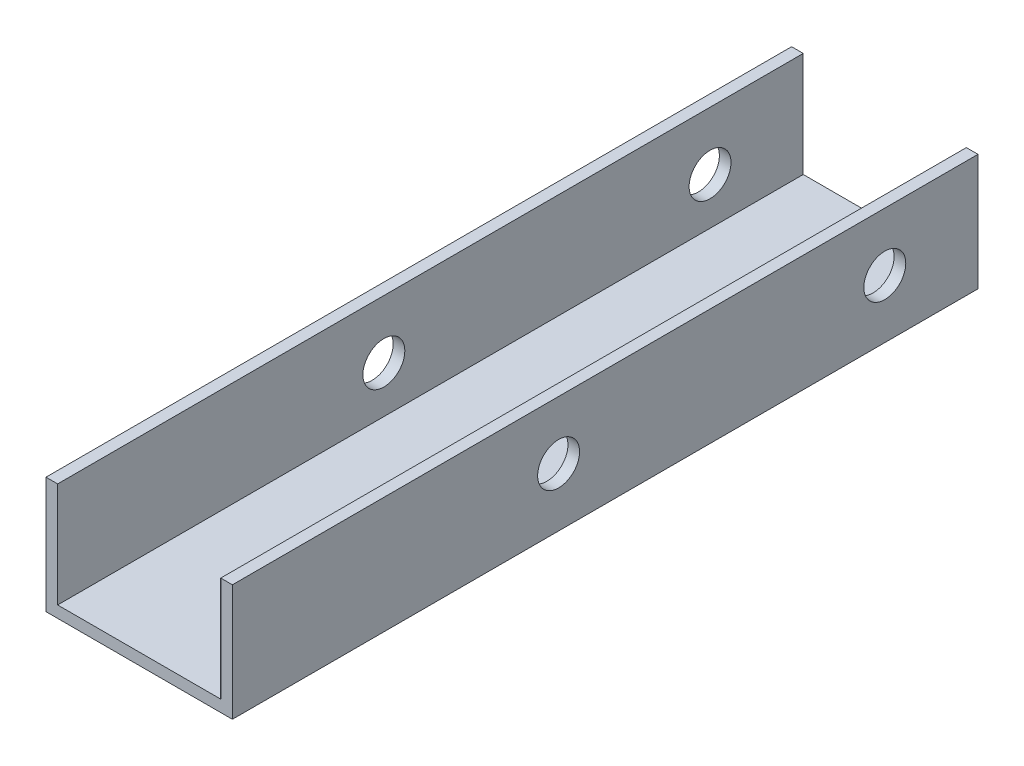
ISO-10303-21;
HEADER;
FILE_DESCRIPTION(('STEP AP214'),'2;1');
FILE_NAME('part.step','',(''),(''),'','','');
FILE_SCHEMA(('AUTOMOTIVE_DESIGN { 1 0 10303 214 1 1 1 1 }'));
ENDSEC;
DATA;
#1=APPLICATION_CONTEXT('core data for automotive mechanical design processes');
#2=APPLICATION_PROTOCOL_DEFINITION('international standard','automotive_design',2000,#1);
#3=PRODUCT_CONTEXT('',#1,'mechanical');
#4=PRODUCT('Part','Part','',(#3));
#5=PRODUCT_RELATED_PRODUCT_CATEGORY('part','',(#4));
#6=PRODUCT_DEFINITION_FORMATION('','',#4);
#7=PRODUCT_DEFINITION_CONTEXT('part definition',#1,'design');
#8=PRODUCT_DEFINITION('design','',#6,#7);
#9=PRODUCT_DEFINITION_SHAPE('','',#8);
#10=(LENGTH_UNIT() NAMED_UNIT(*) SI_UNIT(.MILLI.,.METRE.));
#11=(NAMED_UNIT(*) PLANE_ANGLE_UNIT() SI_UNIT($,.RADIAN.));
#12=(NAMED_UNIT(*) SI_UNIT($,.STERADIAN.) SOLID_ANGLE_UNIT());
#13=UNCERTAINTY_MEASURE_WITH_UNIT(LENGTH_MEASURE(1.E-05),#10,'distance_accuracy_value','');
#14=(GEOMETRIC_REPRESENTATION_CONTEXT(3) GLOBAL_UNCERTAINTY_ASSIGNED_CONTEXT((#13)) GLOBAL_UNIT_ASSIGNED_CONTEXT((#10,
#11,#12)) REPRESENTATION_CONTEXT('',''));
#15=CARTESIAN_POINT('',(0.,0.,0.));
#16=DIRECTION('',(0.,0.,1.));
#17=DIRECTION('',(1.,0.,0.));
#18=AXIS2_PLACEMENT_3D('',#15,#16,#17);
#19=CARTESIAN_POINT('',(0.,0.,500.));
#20=DIRECTION('',(1.,0.,0.));
#21=DIRECTION('',(0.,0.,-1.));
#22=AXIS2_PLACEMENT_3D('',#19,#20,#21);
#23=PLANE('',#22);
#24=CARTESIAN_POINT('',(0.,25.,330.));
#25=DIRECTION('',(1.,0.,0.));
#26=DIRECTION('',(0.,0.,-1.));
#27=AXIS2_PLACEMENT_3D('',#24,#25,#26);
#28=CIRCLE('',#27,8.99999999999998);
#29=CARTESIAN_POINT('',(0.,25.,321.));
#30=VERTEX_POINT('',#29);
#31=EDGE_CURVE('E114',#30,#30,#28,.T.);
#32=ORIENTED_EDGE('',*,*,#31,.T.);
#33=EDGE_LOOP('',(#32));
#34=FACE_BOUND('',#33,.T.);
#35=CARTESIAN_POINT('',(0.,25.,190.));
#36=DIRECTION('',(1.,0.,0.));
#37=DIRECTION('',(0.,0.,-1.));
#38=AXIS2_PLACEMENT_3D('',#35,#36,#37);
#39=CIRCLE('',#38,8.99999999999998);
#40=CARTESIAN_POINT('',(0.,25.,181.));
#41=VERTEX_POINT('',#40);
#42=EDGE_CURVE('E137',#41,#41,#39,.T.);
#43=ORIENTED_EDGE('',*,*,#42,.T.);
#44=EDGE_LOOP('',(#43));
#45=FACE_BOUND('',#44,.T.);
#46=DIRECTION('',(0.,-1.,0.));
#47=VECTOR('',#46,1.);
#48=CARTESIAN_POINT('',(0.,50.,470.));
#49=LINE('',#48,#47);
#50=CARTESIAN_POINT('',(0.,50.,470.));
#51=VERTEX_POINT('',#50);
#52=CARTESIAN_POINT('',(0.,0.,470.));
#53=VERTEX_POINT('',#52);
#54=EDGE_CURVE('E101',#51,#53,#49,.T.);
#55=ORIENTED_EDGE('',*,*,#54,.F.);
#56=DIRECTION('',(0.,0.,-1.));
#57=VECTOR('',#56,1.);
#58=CARTESIAN_POINT('',(0.,50.,500.));
#59=LINE('',#58,#57);
#60=CARTESIAN_POINT('',(0.,50.,150.));
#61=VERTEX_POINT('',#60);
#62=EDGE_CURVE('E59',#51,#61,#59,.T.);
#63=ORIENTED_EDGE('',*,*,#62,.T.);
#64=DIRECTION('',(0.,1.,0.));
#65=VECTOR('',#64,1.);
#66=CARTESIAN_POINT('',(0.,0.,150.));
#67=LINE('',#66,#65);
#68=CARTESIAN_POINT('',(0.,0.,150.));
#69=VERTEX_POINT('',#68);
#70=EDGE_CURVE('E225',#69,#61,#67,.T.);
#71=ORIENTED_EDGE('',*,*,#70,.F.);
#72=DIRECTION('',(0.,0.,-1.));
#73=VECTOR('',#72,1.);
#74=CARTESIAN_POINT('',(0.,0.,500.));
#75=LINE('',#74,#73);
#76=EDGE_CURVE('E11',#53,#69,#75,.T.);
#77=ORIENTED_EDGE('',*,*,#76,.F.);
#78=EDGE_LOOP('',(#55,#63,#71,#77));
#79=FACE_BOUND('',#78,.T.);
#80=ADVANCED_FACE('F35',(#34,#45,#79),#23,.F.);
#81=CARTESIAN_POINT('',(0.,0.,500.));
#82=DIRECTION('',(0.,1.,0.));
#83=DIRECTION('',(0.,0.,1.));
#84=AXIS2_PLACEMENT_3D('',#81,#82,#83);
#85=PLANE('',#84);
#86=DIRECTION('',(1.,0.,0.));
#87=VECTOR('',#86,1.);
#88=CARTESIAN_POINT('',(0.,0.,470.));
#89=LINE('',#88,#87);
#90=CARTESIAN_POINT('',(80.,0.,470.));
#91=VERTEX_POINT('',#90);
#92=EDGE_CURVE('E107',#53,#91,#89,.T.);
#93=ORIENTED_EDGE('',*,*,#92,.F.);
#94=ORIENTED_EDGE('',*,*,#76,.T.);
#95=DIRECTION('',(-1.,0.,0.));
#96=VECTOR('',#95,1.);
#97=CARTESIAN_POINT('',(80.,0.,150.));
#98=LINE('',#97,#96);
#99=CARTESIAN_POINT('',(80.,0.,150.));
#100=VERTEX_POINT('',#99);
#101=EDGE_CURVE('E227',#100,#69,#98,.T.);
#102=ORIENTED_EDGE('',*,*,#101,.F.);
#103=DIRECTION('',(0.,0.,-1.));
#104=VECTOR('',#103,1.);
#105=CARTESIAN_POINT('',(80.,0.,500.));
#106=LINE('',#105,#104);
#107=EDGE_CURVE('E43',#91,#100,#106,.T.);
#108=ORIENTED_EDGE('',*,*,#107,.F.);
#109=EDGE_LOOP('',(#93,#94,#102,#108));
#110=FACE_BOUND('',#109,.T.);
#111=ADVANCED_FACE('F170',(#110),#85,.F.);
#112=CARTESIAN_POINT('',(80.,0.,500.));
#113=DIRECTION('',(-1.,0.,0.));
#114=DIRECTION('',(0.,0.,1.));
#115=AXIS2_PLACEMENT_3D('',#112,#113,#114);
#116=PLANE('',#115);
#117=CARTESIAN_POINT('',(80.,25.,330.));
#118=DIRECTION('',(1.,0.,0.));
#119=DIRECTION('',(0.,0.,-1.));
#120=AXIS2_PLACEMENT_3D('',#117,#118,#119);
#121=CIRCLE('',#120,8.99999999999998);
#122=CARTESIAN_POINT('',(80.,25.,321.));
#123=VERTEX_POINT('',#122);
#124=EDGE_CURVE('E133',#123,#123,#121,.T.);
#125=ORIENTED_EDGE('',*,*,#124,.F.);
#126=EDGE_LOOP('',(#125));
#127=FACE_BOUND('',#126,.T.);
#128=CARTESIAN_POINT('',(80.,25.,190.));
#129=DIRECTION('',(1.,0.,0.));
#130=DIRECTION('',(0.,0.,-1.));
#131=AXIS2_PLACEMENT_3D('',#128,#129,#130);
#132=CIRCLE('',#131,8.99999999999998);
#133=CARTESIAN_POINT('',(80.,25.,181.));
#134=VERTEX_POINT('',#133);
#135=EDGE_CURVE('E140',#134,#134,#132,.T.);
#136=ORIENTED_EDGE('',*,*,#135,.F.);
#137=EDGE_LOOP('',(#136));
#138=FACE_BOUND('',#137,.T.);
#139=DIRECTION('',(0.,1.,0.));
#140=VECTOR('',#139,1.);
#141=CARTESIAN_POINT('',(80.,0.,470.));
#142=LINE('',#141,#140);
#143=CARTESIAN_POINT('',(80.,50.,470.));
#144=VERTEX_POINT('',#143);
#145=EDGE_CURVE('E233',#91,#144,#142,.T.);
#146=ORIENTED_EDGE('',*,*,#145,.F.);
#147=ORIENTED_EDGE('',*,*,#107,.T.);
#148=DIRECTION('',(0.,-1.,0.));
#149=VECTOR('',#148,1.);
#150=CARTESIAN_POINT('',(80.,50.,150.));
#151=LINE('',#150,#149);
#152=CARTESIAN_POINT('',(80.,50.,150.));
#153=VERTEX_POINT('',#152);
#154=EDGE_CURVE('E145',#153,#100,#151,.T.);
#155=ORIENTED_EDGE('',*,*,#154,.F.);
#156=DIRECTION('',(0.,0.,-1.));
#157=VECTOR('',#156,1.);
#158=CARTESIAN_POINT('',(80.,50.,500.));
#159=LINE('',#158,#157);
#160=EDGE_CURVE('E128',#144,#153,#159,.T.);
#161=ORIENTED_EDGE('',*,*,#160,.F.);
#162=EDGE_LOOP('',(#146,#147,#155,#161));
#163=FACE_BOUND('',#162,.T.);
#164=ADVANCED_FACE('F239',(#127,#138,#163),#116,.F.);
#165=CARTESIAN_POINT('',(80.,50.,500.));
#166=DIRECTION('',(0.,-1.,0.));
#167=DIRECTION('',(0.,0.,-1.));
#168=AXIS2_PLACEMENT_3D('',#165,#166,#167);
#169=PLANE('',#168);
#170=DIRECTION('',(-1.,0.,0.));
#171=VECTOR('',#170,1.);
#172=CARTESIAN_POINT('',(80.,50.,470.));
#173=LINE('',#172,#171);
#174=CARTESIAN_POINT('',(75.,50.,470.));
#175=VERTEX_POINT('',#174);
#176=EDGE_CURVE('E204',#144,#175,#173,.T.);
#177=ORIENTED_EDGE('',*,*,#176,.F.);
#178=ORIENTED_EDGE('',*,*,#160,.T.);
#179=DIRECTION('',(1.,0.,0.));
#180=VECTOR('',#179,1.);
#181=CARTESIAN_POINT('',(75.,50.,150.));
#182=LINE('',#181,#180);
#183=CARTESIAN_POINT('',(75.,50.,150.));
#184=VERTEX_POINT('',#183);
#185=EDGE_CURVE('E211',#184,#153,#182,.T.);
#186=ORIENTED_EDGE('',*,*,#185,.F.);
#187=DIRECTION('',(0.,0.,-1.));
#188=VECTOR('',#187,1.);
#189=CARTESIAN_POINT('',(75.,50.,500.));
#190=LINE('',#189,#188);
#191=EDGE_CURVE('E126',#175,#184,#190,.T.);
#192=ORIENTED_EDGE('',*,*,#191,.F.);
#193=EDGE_LOOP('',(#177,#178,#186,#192));
#194=FACE_BOUND('',#193,.T.);
#195=ADVANCED_FACE('F194',(#194),#169,.F.);
#196=CARTESIAN_POINT('',(75.,50.,500.));
#197=DIRECTION('',(1.,0.,0.));
#198=DIRECTION('',(0.,0.,-1.));
#199=AXIS2_PLACEMENT_3D('',#196,#197,#198);
#200=PLANE('',#199);
#201=CARTESIAN_POINT('',(75.,25.,330.));
#202=DIRECTION('',(1.,0.,0.));
#203=DIRECTION('',(0.,0.,-1.));
#204=AXIS2_PLACEMENT_3D('',#201,#202,#203);
#205=CIRCLE('',#204,8.99999999999998);
#206=CARTESIAN_POINT('',(75.,25.,321.));
#207=VERTEX_POINT('',#206);
#208=EDGE_CURVE('E119',#207,#207,#205,.T.);
#209=ORIENTED_EDGE('',*,*,#208,.T.);
#210=EDGE_LOOP('',(#209));
#211=FACE_BOUND('',#210,.T.);
#212=CARTESIAN_POINT('',(75.,25.,190.));
#213=DIRECTION('',(1.,0.,0.));
#214=DIRECTION('',(0.,0.,-1.));
#215=AXIS2_PLACEMENT_3D('',#212,#213,#214);
#216=CIRCLE('',#215,8.99999999999998);
#217=CARTESIAN_POINT('',(75.,25.,181.));
#218=VERTEX_POINT('',#217);
#219=EDGE_CURVE('E132',#218,#218,#216,.T.);
#220=ORIENTED_EDGE('',*,*,#219,.T.);
#221=EDGE_LOOP('',(#220));
#222=FACE_BOUND('',#221,.T.);
#223=DIRECTION('',(0.,-1.,0.));
#224=VECTOR('',#223,1.);
#225=CARTESIAN_POINT('',(75.,50.,470.));
#226=LINE('',#225,#224);
#227=CARTESIAN_POINT('',(75.,5.,470.));
#228=VERTEX_POINT('',#227);
#229=EDGE_CURVE('E198',#175,#228,#226,.T.);
#230=ORIENTED_EDGE('',*,*,#229,.F.);
#231=ORIENTED_EDGE('',*,*,#191,.T.);
#232=DIRECTION('',(0.,1.,0.));
#233=VECTOR('',#232,1.);
#234=CARTESIAN_POINT('',(75.,5.,150.));
#235=LINE('',#234,#233);
#236=CARTESIAN_POINT('',(75.,5.,150.));
#237=VERTEX_POINT('',#236);
#238=EDGE_CURVE('E215',#237,#184,#235,.T.);
#239=ORIENTED_EDGE('',*,*,#238,.F.);
#240=DIRECTION('',(0.,0.,-1.));
#241=VECTOR('',#240,1.);
#242=CARTESIAN_POINT('',(75.,5.,500.));
#243=LINE('',#242,#241);
#244=EDGE_CURVE('E124',#228,#237,#243,.T.);
#245=ORIENTED_EDGE('',*,*,#244,.F.);
#246=EDGE_LOOP('',(#230,#231,#239,#245));
#247=FACE_BOUND('',#246,.T.);
#248=ADVANCED_FACE('F190',(#211,#222,#247),#200,.F.);
#249=CARTESIAN_POINT('',(5.00000000000001,5.,500.));
#250=DIRECTION('',(0.,-1.,0.));
#251=DIRECTION('',(0.,0.,-1.));
#252=AXIS2_PLACEMENT_3D('',#249,#250,#251);
#253=PLANE('',#252);
#254=DIRECTION('',(-1.,0.,0.));
#255=VECTOR('',#254,1.);
#256=CARTESIAN_POINT('',(75.,5.,470.));
#257=LINE('',#256,#255);
#258=CARTESIAN_POINT('',(5.00000000000001,5.,470.));
#259=VERTEX_POINT('',#258);
#260=EDGE_CURVE('E203',#228,#259,#257,.T.);
#261=ORIENTED_EDGE('',*,*,#260,.F.);
#262=ORIENTED_EDGE('',*,*,#244,.T.);
#263=DIRECTION('',(1.,0.,0.));
#264=VECTOR('',#263,1.);
#265=CARTESIAN_POINT('',(5.00000000000001,5.,150.));
#266=LINE('',#265,#264);
#267=CARTESIAN_POINT('',(5.00000000000001,5.,150.));
#268=VERTEX_POINT('',#267);
#269=EDGE_CURVE('E216',#268,#237,#266,.T.);
#270=ORIENTED_EDGE('',*,*,#269,.F.);
#271=DIRECTION('',(0.,0.,-1.));
#272=VECTOR('',#271,1.);
#273=CARTESIAN_POINT('',(5.00000000000001,5.,500.));
#274=LINE('',#273,#272);
#275=EDGE_CURVE('E116',#259,#268,#274,.T.);
#276=ORIENTED_EDGE('',*,*,#275,.F.);
#277=EDGE_LOOP('',(#261,#262,#270,#276));
#278=FACE_BOUND('',#277,.T.);
#279=ADVANCED_FACE('F193',(#278),#253,.F.);
#280=CARTESIAN_POINT('',(5.,50.,500.));
#281=DIRECTION('',(-1.,0.,0.));
#282=DIRECTION('',(0.,-1.,0.));
#283=AXIS2_PLACEMENT_3D('',#280,#281,#282);
#284=PLANE('',#283);
#285=CARTESIAN_POINT('',(5.,25.,330.));
#286=DIRECTION('',(-1.,0.,0.));
#287=DIRECTION('',(0.,-1.,0.));
#288=AXIS2_PLACEMENT_3D('',#285,#286,#287);
#289=CIRCLE('',#288,8.99999999999998);
#290=CARTESIAN_POINT('',(5.00000000000001,25.,321.));
#291=VERTEX_POINT('',#290);
#292=EDGE_CURVE('E38',#291,#291,#289,.T.);
#293=ORIENTED_EDGE('',*,*,#292,.T.);
#294=EDGE_LOOP('',(#293));
#295=FACE_BOUND('',#294,.T.);
#296=CARTESIAN_POINT('',(5.,25.,190.));
#297=DIRECTION('',(-1.,0.,0.));
#298=DIRECTION('',(0.,-1.,0.));
#299=AXIS2_PLACEMENT_3D('',#296,#297,#298);
#300=CIRCLE('',#299,8.99999999999998);
#301=CARTESIAN_POINT('',(5.00000000000001,25.,181.));
#302=VERTEX_POINT('',#301);
#303=EDGE_CURVE('E130',#302,#302,#300,.T.);
#304=ORIENTED_EDGE('',*,*,#303,.T.);
#305=EDGE_LOOP('',(#304));
#306=FACE_BOUND('',#305,.T.);
#307=DIRECTION('',(0.,1.,0.));
#308=VECTOR('',#307,1.);
#309=CARTESIAN_POINT('',(5.00000000000001,5.,470.));
#310=LINE('',#309,#308);
#311=CARTESIAN_POINT('',(5.,50.,470.));
#312=VERTEX_POINT('',#311);
#313=EDGE_CURVE('E51',#259,#312,#310,.T.);
#314=ORIENTED_EDGE('',*,*,#313,.F.);
#315=ORIENTED_EDGE('',*,*,#275,.T.);
#316=DIRECTION('',(0.,-1.,0.));
#317=VECTOR('',#316,1.);
#318=CARTESIAN_POINT('',(5.,50.,150.));
#319=LINE('',#318,#317);
#320=CARTESIAN_POINT('',(5.,50.,150.));
#321=VERTEX_POINT('',#320);
#322=EDGE_CURVE('E221',#321,#268,#319,.T.);
#323=ORIENTED_EDGE('',*,*,#322,.F.);
#324=DIRECTION('',(0.,0.,-1.));
#325=VECTOR('',#324,1.);
#326=CARTESIAN_POINT('',(5.,50.,500.));
#327=LINE('',#326,#325);
#328=EDGE_CURVE('E113',#312,#321,#327,.T.);
#329=ORIENTED_EDGE('',*,*,#328,.F.);
#330=EDGE_LOOP('',(#314,#315,#323,#329));
#331=FACE_BOUND('',#330,.T.);
#332=ADVANCED_FACE('F157',(#295,#306,#331),#284,.F.);
#333=CARTESIAN_POINT('',(0.,50.,500.));
#334=DIRECTION('',(0.,-1.,0.));
#335=DIRECTION('',(0.,0.,-1.));
#336=AXIS2_PLACEMENT_3D('',#333,#334,#335);
#337=PLANE('',#336);
#338=DIRECTION('',(-1.,0.,0.));
#339=VECTOR('',#338,1.);
#340=CARTESIAN_POINT('',(5.,50.,470.));
#341=LINE('',#340,#339);
#342=EDGE_CURVE('E99',#312,#51,#341,.T.);
#343=ORIENTED_EDGE('',*,*,#342,.F.);
#344=ORIENTED_EDGE('',*,*,#328,.T.);
#345=DIRECTION('',(1.,0.,0.));
#346=VECTOR('',#345,1.);
#347=CARTESIAN_POINT('',(0.,50.,150.));
#348=LINE('',#347,#346);
#349=EDGE_CURVE('E112',#61,#321,#348,.T.);
#350=ORIENTED_EDGE('',*,*,#349,.F.);
#351=ORIENTED_EDGE('',*,*,#62,.F.);
#352=EDGE_LOOP('',(#343,#344,#350,#351));
#353=FACE_BOUND('',#352,.T.);
#354=ADVANCED_FACE('F110',(#353),#337,.F.);
#355=CARTESIAN_POINT('',(-20.,25.,190.));
#356=DIRECTION('',(1.,0.,0.));
#357=DIRECTION('',(0.,0.,-1.));
#358=AXIS2_PLACEMENT_3D('',#355,#356,#357);
#359=CYLINDRICAL_SURFACE('',#358,8.99999999999998);
#360=CARTESIAN_POINT('',(5.00000000000001,25.,181.));
#361=CARTESIAN_POINT('',(4.94791666666667,25.,181.));
#362=CARTESIAN_POINT('',(4.89583333333334,25.,181.));
#363=CARTESIAN_POINT('',(4.79166666666667,25.,181.));
#364=CARTESIAN_POINT('',(4.73958333333334,25.,181.));
#365=CARTESIAN_POINT('',(4.63541666666667,25.,181.));
#366=CARTESIAN_POINT('',(4.58333333333334,25.,181.));
#367=CARTESIAN_POINT('',(4.47916666666667,25.,181.));
#368=CARTESIAN_POINT('',(4.42708333333334,25.,181.));
#369=CARTESIAN_POINT('',(4.32291666666667,25.,181.));
#370=CARTESIAN_POINT('',(4.27083333333334,25.,181.));
#371=CARTESIAN_POINT('',(4.16666666666667,25.,181.));
#372=CARTESIAN_POINT('',(4.11458333333334,25.,181.));
#373=CARTESIAN_POINT('',(4.01041666666667,25.,181.));
#374=CARTESIAN_POINT('',(3.95833333333334,25.,181.));
#375=CARTESIAN_POINT('',(3.85416666666667,25.,181.));
#376=CARTESIAN_POINT('',(3.80208333333334,25.,181.));
#377=CARTESIAN_POINT('',(3.69791666666667,25.,181.));
#378=CARTESIAN_POINT('',(3.64583333333334,25.,181.));
#379=CARTESIAN_POINT('',(3.54166666666667,25.,181.));
#380=CARTESIAN_POINT('',(3.48958333333334,25.,181.));
#381=CARTESIAN_POINT('',(3.38541666666667,25.,181.));
#382=CARTESIAN_POINT('',(3.33333333333334,25.,181.));
#383=CARTESIAN_POINT('',(3.22916666666667,25.,181.));
#384=CARTESIAN_POINT('',(3.17708333333334,25.,181.));
#385=CARTESIAN_POINT('',(3.07291666666667,25.,181.));
#386=CARTESIAN_POINT('',(3.02083333333334,25.,181.));
#387=CARTESIAN_POINT('',(2.91666666666667,25.,181.));
#388=CARTESIAN_POINT('',(2.86458333333334,25.,181.));
#389=CARTESIAN_POINT('',(2.76041666666667,25.,181.));
#390=CARTESIAN_POINT('',(2.70833333333334,25.,181.));
#391=CARTESIAN_POINT('',(2.60416666666667,25.,181.));
#392=CARTESIAN_POINT('',(2.55208333333334,25.,181.));
#393=CARTESIAN_POINT('',(2.44791666666667,25.,181.));
#394=CARTESIAN_POINT('',(2.39583333333334,25.,181.));
#395=CARTESIAN_POINT('',(2.29166666666667,25.,181.));
#396=CARTESIAN_POINT('',(2.23958333333334,25.,181.));
#397=CARTESIAN_POINT('',(2.13541666666667,25.,181.));
#398=CARTESIAN_POINT('',(2.08333333333334,25.,181.));
#399=CARTESIAN_POINT('',(1.97916666666667,25.,181.));
#400=CARTESIAN_POINT('',(1.92708333333334,25.,181.));
#401=CARTESIAN_POINT('',(1.82291666666667,25.,181.));
#402=CARTESIAN_POINT('',(1.77083333333334,25.,181.));
#403=CARTESIAN_POINT('',(1.66666666666667,25.,181.));
#404=CARTESIAN_POINT('',(1.61458333333333,25.,181.));
#405=CARTESIAN_POINT('',(1.51041666666667,25.,181.));
#406=CARTESIAN_POINT('',(1.45833333333333,25.,181.));
#407=CARTESIAN_POINT('',(1.35416666666667,25.,181.));
#408=CARTESIAN_POINT('',(1.30208333333333,25.,181.));
#409=CARTESIAN_POINT('',(1.19791666666667,25.,181.));
#410=CARTESIAN_POINT('',(1.14583333333333,25.,181.));
#411=CARTESIAN_POINT('',(1.04166666666667,25.,181.));
#412=CARTESIAN_POINT('',(0.989583333333332,25.,181.));
#413=CARTESIAN_POINT('',(0.885416666666664,25.,181.));
#414=CARTESIAN_POINT('',(0.833333333333331,25.,181.));
#415=CARTESIAN_POINT('',(0.729166666666664,25.,181.));
#416=CARTESIAN_POINT('',(0.67708333333333,25.,181.));
#417=CARTESIAN_POINT('',(0.572916666666664,25.,181.));
#418=CARTESIAN_POINT('',(0.52083333333333,25.,181.));
#419=CARTESIAN_POINT('',(0.416666666666664,25.,181.));
#420=CARTESIAN_POINT('',(0.36458333333333,25.,181.));
#421=CARTESIAN_POINT('',(0.260416666666663,25.,181.));
#422=CARTESIAN_POINT('',(0.20833333333333,25.,181.));
#423=CARTESIAN_POINT('',(0.104166666666663,25.,181.));
#424=CARTESIAN_POINT('',(0.05208333333333,25.,181.));
#425=CARTESIAN_POINT('',(0.,25.,181.));
#426=B_SPLINE_CURVE_WITH_KNOTS('',3,(#360,#361,#362,#363,#364,#365,#366,#367,#368,#369,#370,
#371,#372,#373,#374,#375,#376,#377,#378,#379,#380,#381,#382,#383,#384,#385,#386,#387,#388,#389,
#390,#391,#392,#393,#394,#395,#396,#397,#398,#399,#400,#401,#402,#403,#404,#405,#406,#407,#408,
#409,#410,#411,#412,#413,#414,#415,#416,#417,#418,#419,#420,#421,#422,#423,#424,#425),
.UNSPECIFIED.,.F.,.F.,(4,2,2,2,2,2,2,2,2,2,2,2,2,2,2,2,2,2,2,2,2,2,2,2,2,2,2,2,2,2,2,2,4),(0.,
0.15625,0.3125,0.46875,0.625000000000001,0.781250000000001,0.937500000000001,1.09375,1.25,
1.40625,1.5625,1.71875,1.87500000000001,2.03125000000001,2.18750000000001,2.34375000000001,
2.50000000000001,2.65625000000001,2.81250000000001,2.96875000000001,3.12500000000001,
3.28125000000001,3.43750000000001,3.59375000000001,3.75000000000001,3.90625000000001,
4.06250000000001,4.21875000000001,4.37500000000001,4.53125000000001,4.68750000000001,
4.84375000000001,5.00000000000001),.UNSPECIFIED.);
#427=EDGE_CURVE('BSEAM163',#302,#41,#426,.T.);
#428=ORIENTED_EDGE('',*,*,#303,.F.);
#429=ORIENTED_EDGE('',*,*,#42,.F.);
#430=ORIENTED_EDGE('',*,*,#427,.T.);
#431=ORIENTED_EDGE('',*,*,#427,.F.);
#432=EDGE_LOOP('',(#428,#430,#429,#431));
#433=FACE_BOUND('',#432,.T.);
#434=ADVANCED_FACE('F163',(#433),#359,.F.);
#435=CARTESIAN_POINT('',(-20.,25.,330.));
#436=DIRECTION('',(1.,0.,0.));
#437=DIRECTION('',(0.,0.,-1.));
#438=AXIS2_PLACEMENT_3D('',#435,#436,#437);
#439=CYLINDRICAL_SURFACE('',#438,8.99999999999998);
#440=CARTESIAN_POINT('',(5.00000000000001,25.,321.));
#441=CARTESIAN_POINT('',(4.94791666666667,25.,321.));
#442=CARTESIAN_POINT('',(4.89583333333334,25.,321.));
#443=CARTESIAN_POINT('',(4.79166666666667,25.,321.));
#444=CARTESIAN_POINT('',(4.73958333333334,25.,321.));
#445=CARTESIAN_POINT('',(4.63541666666667,25.,321.));
#446=CARTESIAN_POINT('',(4.58333333333334,25.,321.));
#447=CARTESIAN_POINT('',(4.47916666666667,25.,321.));
#448=CARTESIAN_POINT('',(4.42708333333334,25.,321.));
#449=CARTESIAN_POINT('',(4.32291666666667,25.,321.));
#450=CARTESIAN_POINT('',(4.27083333333334,25.,321.));
#451=CARTESIAN_POINT('',(4.16666666666667,25.,321.));
#452=CARTESIAN_POINT('',(4.11458333333334,25.,321.));
#453=CARTESIAN_POINT('',(4.01041666666667,25.,321.));
#454=CARTESIAN_POINT('',(3.95833333333334,25.,321.));
#455=CARTESIAN_POINT('',(3.85416666666667,25.,321.));
#456=CARTESIAN_POINT('',(3.80208333333334,25.,321.));
#457=CARTESIAN_POINT('',(3.69791666666667,25.,321.));
#458=CARTESIAN_POINT('',(3.64583333333334,25.,321.));
#459=CARTESIAN_POINT('',(3.54166666666667,25.,321.));
#460=CARTESIAN_POINT('',(3.48958333333334,25.,321.));
#461=CARTESIAN_POINT('',(3.38541666666667,25.,321.));
#462=CARTESIAN_POINT('',(3.33333333333334,25.,321.));
#463=CARTESIAN_POINT('',(3.22916666666667,25.,321.));
#464=CARTESIAN_POINT('',(3.17708333333334,25.,321.));
#465=CARTESIAN_POINT('',(3.07291666666667,25.,321.));
#466=CARTESIAN_POINT('',(3.02083333333334,25.,321.));
#467=CARTESIAN_POINT('',(2.91666666666667,25.,321.));
#468=CARTESIAN_POINT('',(2.86458333333334,25.,321.));
#469=CARTESIAN_POINT('',(2.76041666666667,25.,321.));
#470=CARTESIAN_POINT('',(2.70833333333334,25.,321.));
#471=CARTESIAN_POINT('',(2.60416666666667,25.,321.));
#472=CARTESIAN_POINT('',(2.55208333333334,25.,321.));
#473=CARTESIAN_POINT('',(2.44791666666667,25.,321.));
#474=CARTESIAN_POINT('',(2.39583333333334,25.,321.));
#475=CARTESIAN_POINT('',(2.29166666666667,25.,321.));
#476=CARTESIAN_POINT('',(2.23958333333334,25.,321.));
#477=CARTESIAN_POINT('',(2.13541666666667,25.,321.));
#478=CARTESIAN_POINT('',(2.08333333333334,25.,321.));
#479=CARTESIAN_POINT('',(1.97916666666667,25.,321.));
#480=CARTESIAN_POINT('',(1.92708333333334,25.,321.));
#481=CARTESIAN_POINT('',(1.82291666666667,25.,321.));
#482=CARTESIAN_POINT('',(1.77083333333334,25.,321.));
#483=CARTESIAN_POINT('',(1.66666666666667,25.,321.));
#484=CARTESIAN_POINT('',(1.61458333333333,25.,321.));
#485=CARTESIAN_POINT('',(1.51041666666667,25.,321.));
#486=CARTESIAN_POINT('',(1.45833333333333,25.,321.));
#487=CARTESIAN_POINT('',(1.35416666666667,25.,321.));
#488=CARTESIAN_POINT('',(1.30208333333333,25.,321.));
#489=CARTESIAN_POINT('',(1.19791666666667,25.,321.));
#490=CARTESIAN_POINT('',(1.14583333333333,25.,321.));
#491=CARTESIAN_POINT('',(1.04166666666667,25.,321.));
#492=CARTESIAN_POINT('',(0.989583333333332,25.,321.));
#493=CARTESIAN_POINT('',(0.885416666666664,25.,321.));
#494=CARTESIAN_POINT('',(0.833333333333331,25.,321.));
#495=CARTESIAN_POINT('',(0.729166666666664,25.,321.));
#496=CARTESIAN_POINT('',(0.67708333333333,25.,321.));
#497=CARTESIAN_POINT('',(0.572916666666664,25.,321.));
#498=CARTESIAN_POINT('',(0.52083333333333,25.,321.));
#499=CARTESIAN_POINT('',(0.416666666666664,25.,321.));
#500=CARTESIAN_POINT('',(0.36458333333333,25.,321.));
#501=CARTESIAN_POINT('',(0.260416666666663,25.,321.));
#502=CARTESIAN_POINT('',(0.20833333333333,25.,321.));
#503=CARTESIAN_POINT('',(0.104166666666663,25.,321.));
#504=CARTESIAN_POINT('',(0.05208333333333,25.,321.));
#505=CARTESIAN_POINT('',(0.,25.,321.));
#506=B_SPLINE_CURVE_WITH_KNOTS('',3,(#440,#441,#442,#443,#444,#445,#446,#447,#448,#449,#450,
#451,#452,#453,#454,#455,#456,#457,#458,#459,#460,#461,#462,#463,#464,#465,#466,#467,#468,#469,
#470,#471,#472,#473,#474,#475,#476,#477,#478,#479,#480,#481,#482,#483,#484,#485,#486,#487,#488,
#489,#490,#491,#492,#493,#494,#495,#496,#497,#498,#499,#500,#501,#502,#503,#504,#505),
.UNSPECIFIED.,.F.,.F.,(4,2,2,2,2,2,2,2,2,2,2,2,2,2,2,2,2,2,2,2,2,2,2,2,2,2,2,2,2,2,2,2,4),(0.,
0.15625,0.3125,0.46875,0.625000000000001,0.781250000000001,0.937500000000001,1.09375,1.25,
1.40625,1.5625,1.71875,1.87500000000001,2.03125000000001,2.18750000000001,2.34375000000001,
2.50000000000001,2.65625000000001,2.81250000000001,2.96875000000001,3.12500000000001,
3.28125000000001,3.43750000000001,3.59375000000001,3.75000000000001,3.90625000000001,
4.06250000000001,4.21875000000001,4.37500000000001,4.53125000000001,4.68750000000001,
4.84375000000001,5.00000000000001),.UNSPECIFIED.);
#507=EDGE_CURVE('BSEAM159',#291,#30,#506,.T.);
#508=ORIENTED_EDGE('',*,*,#292,.F.);
#509=ORIENTED_EDGE('',*,*,#31,.F.);
#510=ORIENTED_EDGE('',*,*,#507,.T.);
#511=ORIENTED_EDGE('',*,*,#507,.F.);
#512=EDGE_LOOP('',(#508,#510,#509,#511));
#513=FACE_BOUND('',#512,.T.);
#514=ADVANCED_FACE('F159',(#513),#439,.F.);
#515=CARTESIAN_POINT('',(80.,25.,181.));
#516=CARTESIAN_POINT('',(79.9479166666667,25.,181.));
#517=CARTESIAN_POINT('',(79.8958333333333,25.,181.));
#518=CARTESIAN_POINT('',(79.7916666666667,25.,181.));
#519=CARTESIAN_POINT('',(79.7395833333333,25.,181.));
#520=CARTESIAN_POINT('',(79.6354166666667,25.,181.));
#521=CARTESIAN_POINT('',(79.5833333333333,25.,181.));
#522=CARTESIAN_POINT('',(79.4791666666667,25.,181.));
#523=CARTESIAN_POINT('',(79.4270833333333,25.,181.));
#524=CARTESIAN_POINT('',(79.3229166666667,25.,181.));
#525=CARTESIAN_POINT('',(79.2708333333333,25.,181.));
#526=CARTESIAN_POINT('',(79.1666666666667,25.,181.));
#527=CARTESIAN_POINT('',(79.1145833333333,25.,181.));
#528=CARTESIAN_POINT('',(79.0104166666667,25.,181.));
#529=CARTESIAN_POINT('',(78.9583333333333,25.,181.));
#530=CARTESIAN_POINT('',(78.8541666666667,25.,181.));
#531=CARTESIAN_POINT('',(78.8020833333333,25.,181.));
#532=CARTESIAN_POINT('',(78.6979166666667,25.,181.));
#533=CARTESIAN_POINT('',(78.6458333333333,25.,181.));
#534=CARTESIAN_POINT('',(78.5416666666667,25.,181.));
#535=CARTESIAN_POINT('',(78.4895833333333,25.,181.));
#536=CARTESIAN_POINT('',(78.3854166666667,25.,181.));
#537=CARTESIAN_POINT('',(78.3333333333333,25.,181.));
#538=CARTESIAN_POINT('',(78.2291666666667,25.,181.));
#539=CARTESIAN_POINT('',(78.1770833333333,25.,181.));
#540=CARTESIAN_POINT('',(78.0729166666667,25.,181.));
#541=CARTESIAN_POINT('',(78.0208333333333,25.,181.));
#542=CARTESIAN_POINT('',(77.9166666666667,25.,181.));
#543=CARTESIAN_POINT('',(77.8645833333333,25.,181.));
#544=CARTESIAN_POINT('',(77.7604166666667,25.,181.));
#545=CARTESIAN_POINT('',(77.7083333333333,25.,181.));
#546=CARTESIAN_POINT('',(77.6041666666667,25.,181.));
#547=CARTESIAN_POINT('',(77.5520833333333,25.,181.));
#548=CARTESIAN_POINT('',(77.4479166666667,25.,181.));
#549=CARTESIAN_POINT('',(77.3958333333333,25.,181.));
#550=CARTESIAN_POINT('',(77.2916666666667,25.,181.));
#551=CARTESIAN_POINT('',(77.2395833333333,25.,181.));
#552=CARTESIAN_POINT('',(77.1354166666667,25.,181.));
#553=CARTESIAN_POINT('',(77.0833333333333,25.,181.));
#554=CARTESIAN_POINT('',(76.9791666666667,25.,181.));
#555=CARTESIAN_POINT('',(76.9270833333333,25.,181.));
#556=CARTESIAN_POINT('',(76.8229166666667,25.,181.));
#557=CARTESIAN_POINT('',(76.7708333333333,25.,181.));
#558=CARTESIAN_POINT('',(76.6666666666667,25.,181.));
#559=CARTESIAN_POINT('',(76.6145833333333,25.,181.));
#560=CARTESIAN_POINT('',(76.5104166666667,25.,181.));
#561=CARTESIAN_POINT('',(76.4583333333333,25.,181.));
#562=CARTESIAN_POINT('',(76.3541666666667,25.,181.));
#563=CARTESIAN_POINT('',(76.3020833333333,25.,181.));
#564=CARTESIAN_POINT('',(76.1979166666667,25.,181.));
#565=CARTESIAN_POINT('',(76.1458333333333,25.,181.));
#566=CARTESIAN_POINT('',(76.0416666666667,25.,181.));
#567=CARTESIAN_POINT('',(75.9895833333333,25.,181.));
#568=CARTESIAN_POINT('',(75.8854166666667,25.,181.));
#569=CARTESIAN_POINT('',(75.8333333333333,25.,181.));
#570=CARTESIAN_POINT('',(75.7291666666667,25.,181.));
#571=CARTESIAN_POINT('',(75.6770833333333,25.,181.));
#572=CARTESIAN_POINT('',(75.5729166666667,25.,181.));
#573=CARTESIAN_POINT('',(75.5208333333333,25.,181.));
#574=CARTESIAN_POINT('',(75.4166666666667,25.,181.));
#575=CARTESIAN_POINT('',(75.3645833333333,25.,181.));
#576=CARTESIAN_POINT('',(75.2604166666667,25.,181.));
#577=CARTESIAN_POINT('',(75.2083333333333,25.,181.));
#578=CARTESIAN_POINT('',(75.1041666666667,25.,181.));
#579=CARTESIAN_POINT('',(75.0520833333333,25.,181.));
#580=CARTESIAN_POINT('',(75.,25.,181.));
#581=B_SPLINE_CURVE_WITH_KNOTS('',3,(#515,#516,#517,#518,#519,#520,#521,#522,#523,#524,#525,
#526,#527,#528,#529,#530,#531,#532,#533,#534,#535,#536,#537,#538,#539,#540,#541,#542,#543,#544,
#545,#546,#547,#548,#549,#550,#551,#552,#553,#554,#555,#556,#557,#558,#559,#560,#561,#562,#563,
#564,#565,#566,#567,#568,#569,#570,#571,#572,#573,#574,#575,#576,#577,#578,#579,#580),
.UNSPECIFIED.,.F.,.F.,(4,2,2,2,2,2,2,2,2,2,2,2,2,2,2,2,2,2,2,2,2,2,2,2,2,2,2,2,2,2,2,2,4),(0.,
0.156249999999997,0.312499999999993,0.468750000000004,0.625000000000001,0.781249999999997,
0.937500000000008,1.09375,1.25,1.40625,1.56249999999999,1.71875,1.875,2.03125,2.18750000000001,
2.34375000000001,2.5,2.65625,2.8125,2.96875000000001,3.125,3.28125,3.43750000000001,
3.59375000000001,3.75,3.90625,4.0625,4.21875000000001,4.375,4.53125,4.68750000000001,
4.84375000000001,5.),.UNSPECIFIED.);
#582=EDGE_CURVE('BSEAM162',#134,#218,#581,.T.);
#583=ORIENTED_EDGE('',*,*,#135,.T.);
#584=ORIENTED_EDGE('',*,*,#219,.F.);
#585=ORIENTED_EDGE('',*,*,#582,.T.);
#586=ORIENTED_EDGE('',*,*,#582,.F.);
#587=EDGE_LOOP('',(#583,#585,#584,#586));
#588=FACE_BOUND('',#587,.T.);
#589=ADVANCED_FACE('F162',(#588),#359,.F.);
#590=CARTESIAN_POINT('',(80.,25.,321.));
#591=CARTESIAN_POINT('',(79.9479166666667,25.,321.));
#592=CARTESIAN_POINT('',(79.8958333333333,25.,321.));
#593=CARTESIAN_POINT('',(79.7916666666667,25.,321.));
#594=CARTESIAN_POINT('',(79.7395833333333,25.,321.));
#595=CARTESIAN_POINT('',(79.6354166666667,25.,321.));
#596=CARTESIAN_POINT('',(79.5833333333333,25.,321.));
#597=CARTESIAN_POINT('',(79.4791666666667,25.,321.));
#598=CARTESIAN_POINT('',(79.4270833333333,25.,321.));
#599=CARTESIAN_POINT('',(79.3229166666667,25.,321.));
#600=CARTESIAN_POINT('',(79.2708333333333,25.,321.));
#601=CARTESIAN_POINT('',(79.1666666666667,25.,321.));
#602=CARTESIAN_POINT('',(79.1145833333333,25.,321.));
#603=CARTESIAN_POINT('',(79.0104166666667,25.,321.));
#604=CARTESIAN_POINT('',(78.9583333333333,25.,321.));
#605=CARTESIAN_POINT('',(78.8541666666667,25.,321.));
#606=CARTESIAN_POINT('',(78.8020833333333,25.,321.));
#607=CARTESIAN_POINT('',(78.6979166666667,25.,321.));
#608=CARTESIAN_POINT('',(78.6458333333333,25.,321.));
#609=CARTESIAN_POINT('',(78.5416666666667,25.,321.));
#610=CARTESIAN_POINT('',(78.4895833333333,25.,321.));
#611=CARTESIAN_POINT('',(78.3854166666667,25.,321.));
#612=CARTESIAN_POINT('',(78.3333333333333,25.,321.));
#613=CARTESIAN_POINT('',(78.2291666666667,25.,321.));
#614=CARTESIAN_POINT('',(78.1770833333333,25.,321.));
#615=CARTESIAN_POINT('',(78.0729166666667,25.,321.));
#616=CARTESIAN_POINT('',(78.0208333333333,25.,321.));
#617=CARTESIAN_POINT('',(77.9166666666667,25.,321.));
#618=CARTESIAN_POINT('',(77.8645833333333,25.,321.));
#619=CARTESIAN_POINT('',(77.7604166666667,25.,321.));
#620=CARTESIAN_POINT('',(77.7083333333333,25.,321.));
#621=CARTESIAN_POINT('',(77.6041666666667,25.,321.));
#622=CARTESIAN_POINT('',(77.5520833333333,25.,321.));
#623=CARTESIAN_POINT('',(77.4479166666667,25.,321.));
#624=CARTESIAN_POINT('',(77.3958333333333,25.,321.));
#625=CARTESIAN_POINT('',(77.2916666666667,25.,321.));
#626=CARTESIAN_POINT('',(77.2395833333333,25.,321.));
#627=CARTESIAN_POINT('',(77.1354166666667,25.,321.));
#628=CARTESIAN_POINT('',(77.0833333333333,25.,321.));
#629=CARTESIAN_POINT('',(76.9791666666667,25.,321.));
#630=CARTESIAN_POINT('',(76.9270833333333,25.,321.));
#631=CARTESIAN_POINT('',(76.8229166666667,25.,321.));
#632=CARTESIAN_POINT('',(76.7708333333333,25.,321.));
#633=CARTESIAN_POINT('',(76.6666666666667,25.,321.));
#634=CARTESIAN_POINT('',(76.6145833333333,25.,321.));
#635=CARTESIAN_POINT('',(76.5104166666667,25.,321.));
#636=CARTESIAN_POINT('',(76.4583333333333,25.,321.));
#637=CARTESIAN_POINT('',(76.3541666666667,25.,321.));
#638=CARTESIAN_POINT('',(76.3020833333333,25.,321.));
#639=CARTESIAN_POINT('',(76.1979166666667,25.,321.));
#640=CARTESIAN_POINT('',(76.1458333333333,25.,321.));
#641=CARTESIAN_POINT('',(76.0416666666667,25.,321.));
#642=CARTESIAN_POINT('',(75.9895833333333,25.,321.));
#643=CARTESIAN_POINT('',(75.8854166666667,25.,321.));
#644=CARTESIAN_POINT('',(75.8333333333333,25.,321.));
#645=CARTESIAN_POINT('',(75.7291666666667,25.,321.));
#646=CARTESIAN_POINT('',(75.6770833333333,25.,321.));
#647=CARTESIAN_POINT('',(75.5729166666667,25.,321.));
#648=CARTESIAN_POINT('',(75.5208333333333,25.,321.));
#649=CARTESIAN_POINT('',(75.4166666666667,25.,321.));
#650=CARTESIAN_POINT('',(75.3645833333333,25.,321.));
#651=CARTESIAN_POINT('',(75.2604166666667,25.,321.));
#652=CARTESIAN_POINT('',(75.2083333333333,25.,321.));
#653=CARTESIAN_POINT('',(75.1041666666667,25.,321.));
#654=CARTESIAN_POINT('',(75.0520833333333,25.,321.));
#655=CARTESIAN_POINT('',(75.,25.,321.));
#656=B_SPLINE_CURVE_WITH_KNOTS('',3,(#590,#591,#592,#593,#594,#595,#596,#597,#598,#599,#600,
#601,#602,#603,#604,#605,#606,#607,#608,#609,#610,#611,#612,#613,#614,#615,#616,#617,#618,#619,
#620,#621,#622,#623,#624,#625,#626,#627,#628,#629,#630,#631,#632,#633,#634,#635,#636,#637,#638,
#639,#640,#641,#642,#643,#644,#645,#646,#647,#648,#649,#650,#651,#652,#653,#654,#655),
.UNSPECIFIED.,.F.,.F.,(4,2,2,2,2,2,2,2,2,2,2,2,2,2,2,2,2,2,2,2,2,2,2,2,2,2,2,2,2,2,2,2,4),(0.,
0.156249999999997,0.312499999999993,0.468750000000004,0.625000000000001,0.781249999999997,
0.937500000000008,1.09375,1.25,1.40625,1.56249999999999,1.71875,1.875,2.03125,2.18750000000001,
2.34375000000001,2.5,2.65625,2.8125,2.96875000000001,3.125,3.28125,3.43750000000001,
3.59375000000001,3.75,3.90625,4.0625,4.21875000000001,4.375,4.53125,4.68750000000001,
4.84375000000001,5.),.UNSPECIFIED.);
#657=EDGE_CURVE('BSEAM165',#123,#207,#656,.T.);
#658=ORIENTED_EDGE('',*,*,#124,.T.);
#659=ORIENTED_EDGE('',*,*,#208,.F.);
#660=ORIENTED_EDGE('',*,*,#657,.T.);
#661=ORIENTED_EDGE('',*,*,#657,.F.);
#662=EDGE_LOOP('',(#658,#660,#659,#661));
#663=FACE_BOUND('',#662,.T.);
#664=ADVANCED_FACE('F165',(#663),#439,.F.);
#665=CARTESIAN_POINT('',(0.,0.,150.));
#666=DIRECTION('',(0.,0.,-1.));
#667=DIRECTION('',(-1.,0.,0.));
#668=AXIS2_PLACEMENT_3D('',#665,#666,#667);
#669=PLANE('',#668);
#670=ORIENTED_EDGE('',*,*,#101,.T.);
#671=ORIENTED_EDGE('',*,*,#70,.T.);
#672=ORIENTED_EDGE('',*,*,#349,.T.);
#673=ORIENTED_EDGE('',*,*,#322,.T.);
#674=ORIENTED_EDGE('',*,*,#269,.T.);
#675=ORIENTED_EDGE('',*,*,#238,.T.);
#676=ORIENTED_EDGE('',*,*,#185,.T.);
#677=ORIENTED_EDGE('',*,*,#154,.T.);
#678=EDGE_LOOP('',(#670,#671,#672,#673,#674,#675,#676,#677));
#679=FACE_BOUND('',#678,.T.);
#680=ADVANCED_FACE('F185',(#679),#669,.T.);
#681=CARTESIAN_POINT('',(0.,0.,470.));
#682=DIRECTION('',(0.,0.,1.));
#683=DIRECTION('',(1.,0.,0.));
#684=AXIS2_PLACEMENT_3D('',#681,#682,#683);
#685=PLANE('',#684);
#686=ORIENTED_EDGE('',*,*,#342,.T.);
#687=ORIENTED_EDGE('',*,*,#54,.T.);
#688=ORIENTED_EDGE('',*,*,#92,.T.);
#689=ORIENTED_EDGE('',*,*,#145,.T.);
#690=ORIENTED_EDGE('',*,*,#176,.T.);
#691=ORIENTED_EDGE('',*,*,#229,.T.);
#692=ORIENTED_EDGE('',*,*,#260,.T.);
#693=ORIENTED_EDGE('',*,*,#313,.T.);
#694=EDGE_LOOP('',(#686,#687,#688,#689,#690,#691,#692,#693));
#695=FACE_BOUND('',#694,.T.);
#696=ADVANCED_FACE('F100',(#695),#685,.T.);
#697=CLOSED_SHELL('',(#80,#111,#164,#195,#248,#279,#332,#354,#434,#514,#589,#664,#680,#696));
#698=MANIFOLD_SOLID_BREP('B2',#697);
#699=ADVANCED_BREP_SHAPE_REPRESENTATION('',(#18,#698),#14);
#700=SHAPE_DEFINITION_REPRESENTATION(#9,#699);
ENDSEC;
END-ISO-10303-21;
